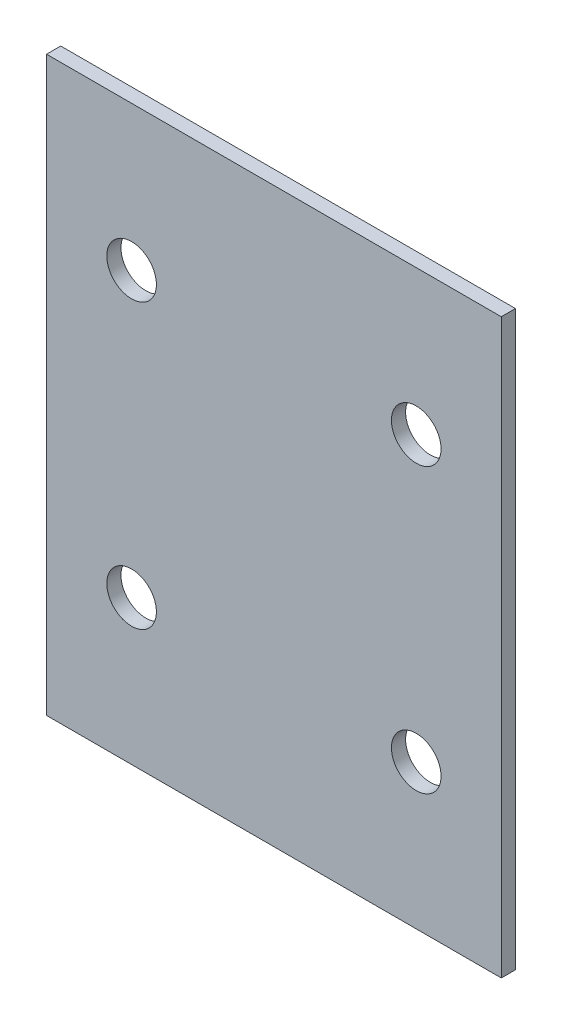
ISO-10303-21;
HEADER;
FILE_DESCRIPTION(('STEP AP214'),'2;1');
FILE_NAME('part.step','',(''),(''),'','','');
FILE_SCHEMA(('AUTOMOTIVE_DESIGN { 1 0 10303 214 1 1 1 1 }'));
ENDSEC;
DATA;
#1=APPLICATION_CONTEXT('core data for automotive mechanical design processes');
#2=APPLICATION_PROTOCOL_DEFINITION('international standard','automotive_design',2000,#1);
#3=PRODUCT_CONTEXT('',#1,'mechanical');
#4=PRODUCT('Part','Part','',(#3));
#5=PRODUCT_RELATED_PRODUCT_CATEGORY('part','',(#4));
#6=PRODUCT_DEFINITION_FORMATION('','',#4);
#7=PRODUCT_DEFINITION_CONTEXT('part definition',#1,'design');
#8=PRODUCT_DEFINITION('design','',#6,#7);
#9=PRODUCT_DEFINITION_SHAPE('','',#8);
#10=(LENGTH_UNIT() NAMED_UNIT(*) SI_UNIT(.MILLI.,.METRE.));
#11=(NAMED_UNIT(*) PLANE_ANGLE_UNIT() SI_UNIT($,.RADIAN.));
#12=(NAMED_UNIT(*) SI_UNIT($,.STERADIAN.) SOLID_ANGLE_UNIT());
#13=UNCERTAINTY_MEASURE_WITH_UNIT(LENGTH_MEASURE(1.E-05),#10,'distance_accuracy_value','');
#14=(GEOMETRIC_REPRESENTATION_CONTEXT(3) GLOBAL_UNCERTAINTY_ASSIGNED_CONTEXT((#13)) GLOBAL_UNIT_ASSIGNED_CONTEXT((#10,
#11,#12)) REPRESENTATION_CONTEXT('',''));
#15=CARTESIAN_POINT('',(0.,0.,0.));
#16=DIRECTION('',(0.,0.,1.));
#17=DIRECTION('',(1.,0.,0.));
#18=AXIS2_PLACEMENT_3D('',#15,#16,#17);
#19=CARTESIAN_POINT('',(-20.2073636978671,267.363604852409,6.35));
#20=DIRECTION('',(1.,0.,0.));
#21=DIRECTION('',(0.,0.,-1.));
#22=AXIS2_PLACEMENT_3D('',#19,#20,#21);
#23=PLANE('',#22);
#24=DIRECTION('',(0.,-1.,0.));
#25=VECTOR('',#24,1.);
#26=CARTESIAN_POINT('',(-20.2073636978671,267.363604852409,0.));
#27=LINE('',#26,#25);
#28=CARTESIAN_POINT('',(-20.2073636978671,267.363604852409,0.));
#29=VERTEX_POINT('',#28);
#30=CARTESIAN_POINT('',(-20.2073636978671,10.8236048524095,0.));
#31=VERTEX_POINT('',#30);
#32=EDGE_CURVE('E105',#29,#31,#27,.T.);
#33=ORIENTED_EDGE('',*,*,#32,.T.);
#34=DIRECTION('',(0.,0.,-1.));
#35=VECTOR('',#34,1.);
#36=CARTESIAN_POINT('',(-20.2073636978671,10.8236048524095,6.35));
#37=LINE('',#36,#35);
#38=CARTESIAN_POINT('',(-20.2073636978671,10.8236048524095,6.35));
#39=VERTEX_POINT('',#38);
#40=EDGE_CURVE('E11',#39,#31,#37,.T.);
#41=ORIENTED_EDGE('',*,*,#40,.F.);
#42=DIRECTION('',(0.,-1.,0.));
#43=VECTOR('',#42,1.);
#44=CARTESIAN_POINT('',(-20.2073636978671,267.363604852409,6.35));
#45=LINE('',#44,#43);
#46=CARTESIAN_POINT('',(-20.2073636978671,267.363604852409,6.35));
#47=VERTEX_POINT('',#46);
#48=EDGE_CURVE('E93',#47,#39,#45,.T.);
#49=ORIENTED_EDGE('',*,*,#48,.F.);
#50=DIRECTION('',(0.,0.,-1.));
#51=VECTOR('',#50,1.);
#52=CARTESIAN_POINT('',(-20.2073636978671,267.363604852409,6.35));
#53=LINE('',#52,#51);
#54=EDGE_CURVE('E101',#47,#29,#53,.T.);
#55=ORIENTED_EDGE('',*,*,#54,.T.);
#56=EDGE_LOOP('',(#33,#41,#49,#55));
#57=FACE_BOUND('',#56,.T.);
#58=ADVANCED_FACE('F42',(#57),#23,.F.);
#59=CARTESIAN_POINT('',(-20.2073636978671,10.8236048524095,6.35));
#60=DIRECTION('',(0.,1.,0.));
#61=DIRECTION('',(0.,0.,1.));
#62=AXIS2_PLACEMENT_3D('',#59,#60,#61);
#63=PLANE('',#62);
#64=DIRECTION('',(1.,0.,0.));
#65=VECTOR('',#64,1.);
#66=CARTESIAN_POINT('',(-20.2073636978671,10.8236048524095,0.));
#67=LINE('',#66,#65);
#68=CARTESIAN_POINT('',(183.500636302133,10.8236048524095,0.));
#69=VERTEX_POINT('',#68);
#70=EDGE_CURVE('E97',#31,#69,#67,.T.);
#71=ORIENTED_EDGE('',*,*,#70,.T.);
#72=DIRECTION('',(0.,0.,-1.));
#73=VECTOR('',#72,1.);
#74=CARTESIAN_POINT('',(183.500636302133,10.8236048524095,6.35));
#75=LINE('',#74,#73);
#76=CARTESIAN_POINT('',(183.500636302133,10.8236048524095,6.35));
#77=VERTEX_POINT('',#76);
#78=EDGE_CURVE('E50',#77,#69,#75,.T.);
#79=ORIENTED_EDGE('',*,*,#78,.F.);
#80=DIRECTION('',(1.,0.,0.));
#81=VECTOR('',#80,1.);
#82=CARTESIAN_POINT('',(-20.2073636978671,10.8236048524095,6.35));
#83=LINE('',#82,#81);
#84=EDGE_CURVE('E88',#39,#77,#83,.T.);
#85=ORIENTED_EDGE('',*,*,#84,.F.);
#86=ORIENTED_EDGE('',*,*,#40,.T.);
#87=EDGE_LOOP('',(#71,#79,#85,#86));
#88=FACE_BOUND('',#87,.T.);
#89=ADVANCED_FACE('F96',(#88),#63,.F.);
#90=CARTESIAN_POINT('',(183.500636302133,267.363604852409,6.35));
#91=DIRECTION('',(-1.,0.,0.));
#92=DIRECTION('',(0.,0.,1.));
#93=AXIS2_PLACEMENT_3D('',#90,#91,#92);
#94=PLANE('',#93);
#95=DIRECTION('',(0.,1.,0.));
#96=VECTOR('',#95,1.);
#97=CARTESIAN_POINT('',(183.500636302133,267.363604852409,0.));
#98=LINE('',#97,#96);
#99=CARTESIAN_POINT('',(183.500636302133,267.363604852409,0.));
#100=VERTEX_POINT('',#99);
#101=EDGE_CURVE('E75',#69,#100,#98,.T.);
#102=ORIENTED_EDGE('',*,*,#101,.T.);
#103=DIRECTION('',(0.,0.,-1.));
#104=VECTOR('',#103,1.);
#105=CARTESIAN_POINT('',(183.500636302133,267.363604852409,6.35));
#106=LINE('',#105,#104);
#107=CARTESIAN_POINT('',(183.500636302133,267.363604852409,6.35));
#108=VERTEX_POINT('',#107);
#109=EDGE_CURVE('E98',#108,#100,#106,.T.);
#110=ORIENTED_EDGE('',*,*,#109,.F.);
#111=DIRECTION('',(0.,1.,0.));
#112=VECTOR('',#111,1.);
#113=CARTESIAN_POINT('',(183.500636302133,267.363604852409,6.35));
#114=LINE('',#113,#112);
#115=EDGE_CURVE('E91',#77,#108,#114,.T.);
#116=ORIENTED_EDGE('',*,*,#115,.F.);
#117=ORIENTED_EDGE('',*,*,#78,.T.);
#118=EDGE_LOOP('',(#102,#110,#116,#117));
#119=FACE_BOUND('',#118,.T.);
#120=ADVANCED_FACE('F99',(#119),#94,.F.);
#121=CARTESIAN_POINT('',(-20.2073636978671,267.363604852409,6.35));
#122=DIRECTION('',(0.,-1.,0.));
#123=DIRECTION('',(0.,0.,-1.));
#124=AXIS2_PLACEMENT_3D('',#121,#122,#123);
#125=PLANE('',#124);
#126=DIRECTION('',(-1.,0.,0.));
#127=VECTOR('',#126,1.);
#128=CARTESIAN_POINT('',(-20.2073636978671,267.363604852409,0.));
#129=LINE('',#128,#127);
#130=EDGE_CURVE('E81',#100,#29,#129,.T.);
#131=ORIENTED_EDGE('',*,*,#130,.T.);
#132=ORIENTED_EDGE('',*,*,#54,.F.);
#133=DIRECTION('',(-1.,0.,0.));
#134=VECTOR('',#133,1.);
#135=CARTESIAN_POINT('',(-20.2073636978671,267.363604852409,6.35));
#136=LINE('',#135,#134);
#137=EDGE_CURVE('E58',#108,#47,#136,.T.);
#138=ORIENTED_EDGE('',*,*,#137,.F.);
#139=ORIENTED_EDGE('',*,*,#109,.T.);
#140=EDGE_LOOP('',(#131,#132,#138,#139));
#141=FACE_BOUND('',#140,.T.);
#142=ADVANCED_FACE('F113',(#141),#125,.F.);
#143=CARTESIAN_POINT('',(-20.2073636978671,10.8236048524095,6.35));
#144=DIRECTION('',(0.,0.,1.));
#145=DIRECTION('',(1.,0.,0.));
#146=AXIS2_PLACEMENT_3D('',#143,#144,#145);
#147=PLANE('',#146);
#148=CARTESIAN_POINT('',(17.8926363021329,75.5936048524095,6.35));
#149=DIRECTION('',(0.,0.,1.));
#150=DIRECTION('',(1.,0.,0.));
#151=AXIS2_PLACEMENT_3D('',#148,#149,#150);
#152=CIRCLE('',#151,11.1125);
#153=CARTESIAN_POINT('',(29.005136302133,75.5936048524095,6.35));
#154=VERTEX_POINT('',#153);
#155=EDGE_CURVE('E137',#154,#154,#152,.F.);
#156=ORIENTED_EDGE('',*,*,#155,.T.);
#157=EDGE_LOOP('',(#156));
#158=FACE_BOUND('',#157,.T.);
#159=CARTESIAN_POINT('',(17.8926363021329,202.59360485241,6.35));
#160=DIRECTION('',(0.,0.,1.));
#161=DIRECTION('',(1.,0.,0.));
#162=AXIS2_PLACEMENT_3D('',#159,#160,#161);
#163=CIRCLE('',#162,11.1125);
#164=CARTESIAN_POINT('',(29.0051363021329,202.59360485241,6.35));
#165=VERTEX_POINT('',#164);
#166=EDGE_CURVE('E131',#165,#165,#163,.F.);
#167=ORIENTED_EDGE('',*,*,#166,.T.);
#168=EDGE_LOOP('',(#167));
#169=FACE_BOUND('',#168,.T.);
#170=CARTESIAN_POINT('',(145.400636302133,75.5936048524095,6.35));
#171=DIRECTION('',(0.,0.,1.));
#172=DIRECTION('',(1.,0.,0.));
#173=AXIS2_PLACEMENT_3D('',#170,#171,#172);
#174=CIRCLE('',#173,11.1125);
#175=CARTESIAN_POINT('',(156.513136302133,75.5936048524095,6.35));
#176=VERTEX_POINT('',#175);
#177=EDGE_CURVE('E125',#176,#176,#174,.F.);
#178=ORIENTED_EDGE('',*,*,#177,.T.);
#179=EDGE_LOOP('',(#178));
#180=FACE_BOUND('',#179,.T.);
#181=CARTESIAN_POINT('',(145.400636302133,202.59360485241,6.35));
#182=DIRECTION('',(0.,0.,1.));
#183=DIRECTION('',(1.,0.,0.));
#184=AXIS2_PLACEMENT_3D('',#181,#182,#183);
#185=CIRCLE('',#184,11.1125);
#186=CARTESIAN_POINT('',(156.513136302133,202.59360485241,6.35));
#187=VERTEX_POINT('',#186);
#188=EDGE_CURVE('E119',#187,#187,#185,.F.);
#189=ORIENTED_EDGE('',*,*,#188,.T.);
#190=EDGE_LOOP('',(#189));
#191=FACE_BOUND('',#190,.T.);
#192=ORIENTED_EDGE('',*,*,#48,.T.);
#193=ORIENTED_EDGE('',*,*,#84,.T.);
#194=ORIENTED_EDGE('',*,*,#115,.T.);
#195=ORIENTED_EDGE('',*,*,#137,.T.);
#196=EDGE_LOOP('',(#192,#193,#194,#195));
#197=FACE_BOUND('',#196,.T.);
#198=ADVANCED_FACE('F89',(#158,#169,#180,#191,#197),#147,.T.);
#199=CARTESIAN_POINT('',(-20.2073636978671,10.8236048524095,0.));
#200=DIRECTION('',(0.,0.,1.));
#201=DIRECTION('',(1.,0.,0.));
#202=AXIS2_PLACEMENT_3D('',#199,#200,#201);
#203=PLANE('',#202);
#204=CARTESIAN_POINT('',(17.8926363021329,75.5936048524095,0.));
#205=DIRECTION('',(0.,0.,-1.));
#206=DIRECTION('',(-1.,0.,0.));
#207=AXIS2_PLACEMENT_3D('',#204,#205,#206);
#208=CIRCLE('',#207,11.1125);
#209=CARTESIAN_POINT('',(6.78013630213294,75.5936048524095,0.));
#210=VERTEX_POINT('',#209);
#211=EDGE_CURVE('E134',#210,#210,#208,.T.);
#212=ORIENTED_EDGE('',*,*,#211,.F.);
#213=EDGE_LOOP('',(#212));
#214=FACE_BOUND('',#213,.T.);
#215=CARTESIAN_POINT('',(17.8926363021329,202.59360485241,0.));
#216=DIRECTION('',(0.,0.,-1.));
#217=DIRECTION('',(-1.,0.,0.));
#218=AXIS2_PLACEMENT_3D('',#215,#216,#217);
#219=CIRCLE('',#218,11.1125);
#220=CARTESIAN_POINT('',(6.78013630213295,202.59360485241,0.));
#221=VERTEX_POINT('',#220);
#222=EDGE_CURVE('E128',#221,#221,#219,.T.);
#223=ORIENTED_EDGE('',*,*,#222,.F.);
#224=EDGE_LOOP('',(#223));
#225=FACE_BOUND('',#224,.T.);
#226=CARTESIAN_POINT('',(145.400636302133,75.5936048524095,0.));
#227=DIRECTION('',(0.,0.,-1.));
#228=DIRECTION('',(-1.,0.,0.));
#229=AXIS2_PLACEMENT_3D('',#226,#227,#228);
#230=CIRCLE('',#229,11.1125);
#231=CARTESIAN_POINT('',(134.288136302133,75.5936048524095,0.));
#232=VERTEX_POINT('',#231);
#233=EDGE_CURVE('E122',#232,#232,#230,.T.);
#234=ORIENTED_EDGE('',*,*,#233,.F.);
#235=EDGE_LOOP('',(#234));
#236=FACE_BOUND('',#235,.T.);
#237=CARTESIAN_POINT('',(145.400636302133,202.59360485241,0.));
#238=DIRECTION('',(0.,0.,-1.));
#239=DIRECTION('',(-1.,0.,0.));
#240=AXIS2_PLACEMENT_3D('',#237,#238,#239);
#241=CIRCLE('',#240,11.1125);
#242=CARTESIAN_POINT('',(134.288136302133,202.59360485241,0.));
#243=VERTEX_POINT('',#242);
#244=EDGE_CURVE('E108',#243,#243,#241,.T.);
#245=ORIENTED_EDGE('',*,*,#244,.F.);
#246=EDGE_LOOP('',(#245));
#247=FACE_BOUND('',#246,.T.);
#248=ORIENTED_EDGE('',*,*,#32,.F.);
#249=ORIENTED_EDGE('',*,*,#130,.F.);
#250=ORIENTED_EDGE('',*,*,#101,.F.);
#251=ORIENTED_EDGE('',*,*,#70,.F.);
#252=EDGE_LOOP('',(#248,#249,#250,#251));
#253=FACE_BOUND('',#252,.T.);
#254=ADVANCED_FACE('F116',(#214,#225,#236,#247,#253),#203,.F.);
#255=CARTESIAN_POINT('',(145.400636302133,202.59360485241,6.351));
#256=DIRECTION('',(0.,0.,-1.));
#257=DIRECTION('',(-1.,0.,0.));
#258=AXIS2_PLACEMENT_3D('',#255,#256,#257);
#259=CYLINDRICAL_SURFACE('',#258,11.1125);
#260=ORIENTED_EDGE('',*,*,#188,.F.);
#261=EDGE_LOOP('',(#260));
#262=FACE_BOUND('',#261,.T.);
#263=ORIENTED_EDGE('',*,*,#244,.T.);
#264=EDGE_LOOP('',(#263));
#265=FACE_BOUND('',#264,.T.);
#266=ADVANCED_FACE('F147',(#262,#265),#259,.F.);
#267=CARTESIAN_POINT('',(145.400636302133,75.5936048524095,6.351));
#268=DIRECTION('',(0.,0.,-1.));
#269=DIRECTION('',(-1.,0.,0.));
#270=AXIS2_PLACEMENT_3D('',#267,#268,#269);
#271=CYLINDRICAL_SURFACE('',#270,11.1125);
#272=ORIENTED_EDGE('',*,*,#177,.F.);
#273=EDGE_LOOP('',(#272));
#274=FACE_BOUND('',#273,.T.);
#275=ORIENTED_EDGE('',*,*,#233,.T.);
#276=EDGE_LOOP('',(#275));
#277=FACE_BOUND('',#276,.T.);
#278=ADVANCED_FACE('F156',(#274,#277),#271,.F.);
#279=CARTESIAN_POINT('',(17.8926363021329,202.59360485241,6.351));
#280=DIRECTION('',(0.,0.,-1.));
#281=DIRECTION('',(-1.,0.,0.));
#282=AXIS2_PLACEMENT_3D('',#279,#280,#281);
#283=CYLINDRICAL_SURFACE('',#282,11.1125);
#284=ORIENTED_EDGE('',*,*,#166,.F.);
#285=EDGE_LOOP('',(#284));
#286=FACE_BOUND('',#285,.T.);
#287=ORIENTED_EDGE('',*,*,#222,.T.);
#288=EDGE_LOOP('',(#287));
#289=FACE_BOUND('',#288,.T.);
#290=ADVANCED_FACE('F163',(#286,#289),#283,.F.);
#291=CARTESIAN_POINT('',(17.8926363021329,75.5936048524095,6.351));
#292=DIRECTION('',(0.,0.,-1.));
#293=DIRECTION('',(-1.,0.,0.));
#294=AXIS2_PLACEMENT_3D('',#291,#292,#293);
#295=CYLINDRICAL_SURFACE('',#294,11.1125);
#296=ORIENTED_EDGE('',*,*,#155,.F.);
#297=EDGE_LOOP('',(#296));
#298=FACE_BOUND('',#297,.T.);
#299=ORIENTED_EDGE('',*,*,#211,.T.);
#300=EDGE_LOOP('',(#299));
#301=FACE_BOUND('',#300,.T.);
#302=ADVANCED_FACE('F143',(#298,#301),#295,.F.);
#303=CLOSED_SHELL('',(#58,#89,#120,#142,#198,#254,#266,#278,#290,#302));
#304=MANIFOLD_SOLID_BREP('B2',#303);
#305=ADVANCED_BREP_SHAPE_REPRESENTATION('',(#18,#304),#14);
#306=SHAPE_DEFINITION_REPRESENTATION(#9,#305);
ENDSEC;
END-ISO-10303-21;
